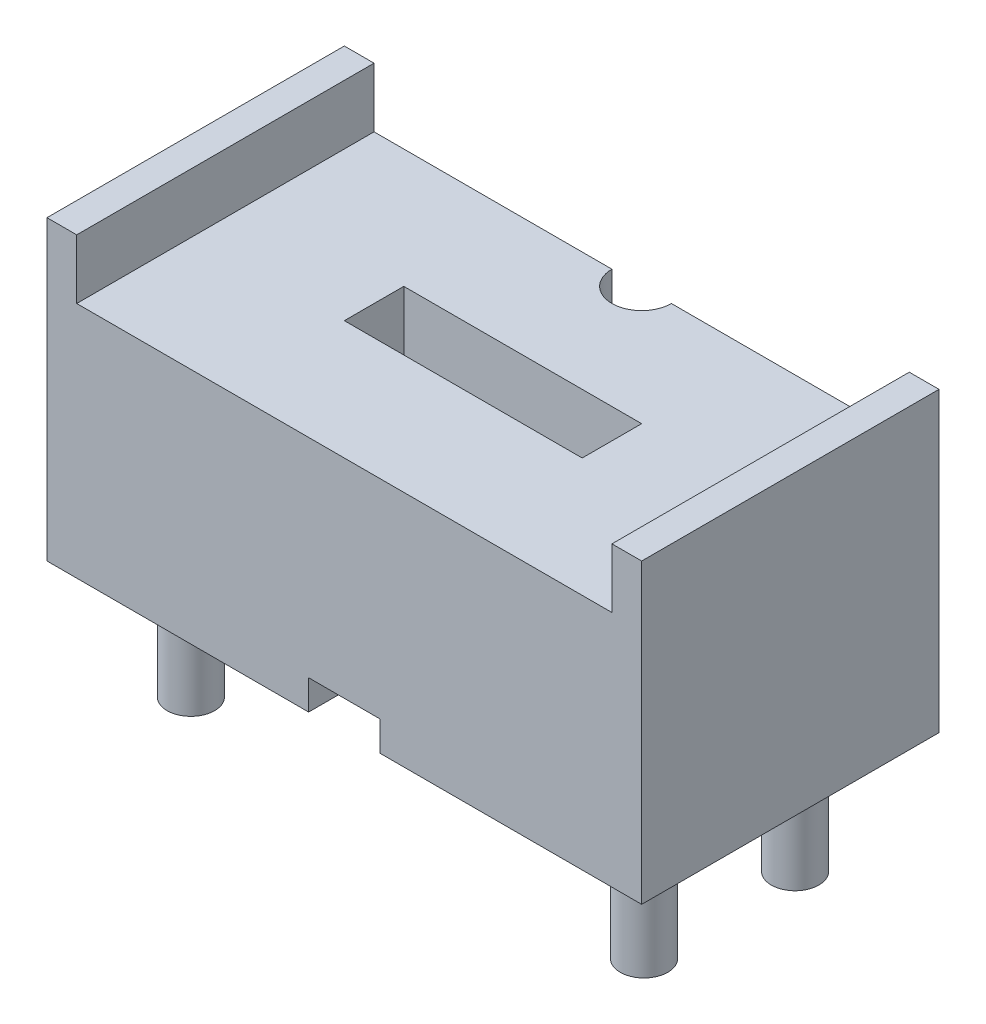
ISO-10303-21;
HEADER;
FILE_DESCRIPTION(('STEP AP214'),'2;1');
FILE_NAME('part.step','',(''),(''),'','','');
FILE_SCHEMA(('AUTOMOTIVE_DESIGN { 1 0 10303 214 1 1 1 1 }'));
ENDSEC;
DATA;
#1=APPLICATION_CONTEXT('core data for automotive mechanical design processes');
#2=APPLICATION_PROTOCOL_DEFINITION('international standard','automotive_design',2000,#1);
#3=PRODUCT_CONTEXT('',#1,'mechanical');
#4=PRODUCT('Part','Part','',(#3));
#5=PRODUCT_RELATED_PRODUCT_CATEGORY('part','',(#4));
#6=PRODUCT_DEFINITION_FORMATION('','',#4);
#7=PRODUCT_DEFINITION_CONTEXT('part definition',#1,'design');
#8=PRODUCT_DEFINITION('design','',#6,#7);
#9=PRODUCT_DEFINITION_SHAPE('','',#8);
#10=(LENGTH_UNIT() NAMED_UNIT(*) SI_UNIT(.MILLI.,.METRE.));
#11=(NAMED_UNIT(*) PLANE_ANGLE_UNIT() SI_UNIT($,.RADIAN.));
#12=(NAMED_UNIT(*) SI_UNIT($,.STERADIAN.) SOLID_ANGLE_UNIT());
#13=UNCERTAINTY_MEASURE_WITH_UNIT(LENGTH_MEASURE(1.E-05),#10,'distance_accuracy_value','');
#14=(GEOMETRIC_REPRESENTATION_CONTEXT(3) GLOBAL_UNCERTAINTY_ASSIGNED_CONTEXT((#13)) GLOBAL_UNIT_ASSIGNED_CONTEXT((#10,
#11,#12)) REPRESENTATION_CONTEXT('',''));
#15=CARTESIAN_POINT('',(0.,0.,0.));
#16=DIRECTION('',(0.,0.,1.));
#17=DIRECTION('',(1.,0.,0.));
#18=AXIS2_PLACEMENT_3D('',#15,#16,#17);
#19=CARTESIAN_POINT('',(0.,0.,0.));
#20=DIRECTION('',(0.,1.,0.));
#21=DIRECTION('',(0.,0.,1.));
#22=AXIS2_PLACEMENT_3D('',#19,#20,#21);
#23=PLANE('',#22);
#24=CARTESIAN_POINT('',(8.81,0.,-3.77));
#25=DIRECTION('',(0.,1.,0.));
#26=DIRECTION('',(0.,0.,1.));
#27=AXIS2_PLACEMENT_3D('',#24,#25,#26);
#28=CIRCLE('',#27,0.400000000000001);
#29=CARTESIAN_POINT('',(8.81,0.,-3.37));
#30=VERTEX_POINT('',#29);
#31=EDGE_CURVE('E43',#30,#30,#28,.F.);
#32=ORIENTED_EDGE('',*,*,#31,.F.);
#33=EDGE_LOOP('',(#32));
#34=FACE_BOUND('',#33,.T.);
#35=DIRECTION('',(0.,0.,1.));
#36=VECTOR('',#35,1.);
#37=CARTESIAN_POINT('',(5.6,0.,-5.001));
#38=LINE('',#37,#36);
#39=CARTESIAN_POINT('',(5.6,0.,-2.));
#40=VERTEX_POINT('',#39);
#41=CARTESIAN_POINT('',(5.6,0.,0.));
#42=VERTEX_POINT('',#41);
#43=EDGE_CURVE('E205',#40,#42,#38,.T.);
#44=ORIENTED_EDGE('',*,*,#43,.F.);
#45=DIRECTION('',(-1.,0.,0.));
#46=VECTOR('',#45,1.);
#47=CARTESIAN_POINT('',(3.,0.,-2.));
#48=LINE('',#47,#46);
#49=CARTESIAN_POINT('',(7.,0.,-2.));
#50=VERTEX_POINT('',#49);
#51=EDGE_CURVE('E185',#50,#40,#48,.T.);
#52=ORIENTED_EDGE('',*,*,#51,.F.);
#53=DIRECTION('',(0.,0.,1.));
#54=VECTOR('',#53,1.);
#55=CARTESIAN_POINT('',(7.,0.,-2.));
#56=LINE('',#55,#54);
#57=CARTESIAN_POINT('',(7.,0.,-3.));
#58=VERTEX_POINT('',#57);
#59=EDGE_CURVE('E194',#58,#50,#56,.T.);
#60=ORIENTED_EDGE('',*,*,#59,.F.);
#61=DIRECTION('',(1.,0.,0.));
#62=VECTOR('',#61,1.);
#63=CARTESIAN_POINT('',(7.,0.,-3.));
#64=LINE('',#63,#62);
#65=CARTESIAN_POINT('',(5.6,0.,-3.));
#66=VERTEX_POINT('',#65);
#67=EDGE_CURVE('E207',#66,#58,#64,.T.);
#68=ORIENTED_EDGE('',*,*,#67,.F.);
#69=CARTESIAN_POINT('',(5.6,0.,-5.));
#70=VERTEX_POINT('',#69);
#71=EDGE_CURVE('E270',#70,#66,#38,.T.);
#72=ORIENTED_EDGE('',*,*,#71,.F.);
#73=DIRECTION('',(-1.,0.,0.));
#74=VECTOR('',#73,1.);
#75=CARTESIAN_POINT('',(10.,0.,-5.));
#76=LINE('',#75,#74);
#77=CARTESIAN_POINT('',(10.,0.,-5.));
#78=VERTEX_POINT('',#77);
#79=EDGE_CURVE('E321',#78,#70,#76,.T.);
#80=ORIENTED_EDGE('',*,*,#79,.F.);
#81=DIRECTION('',(0.,0.,-1.));
#82=VECTOR('',#81,1.);
#83=CARTESIAN_POINT('',(10.,0.,0.));
#84=LINE('',#83,#82);
#85=CARTESIAN_POINT('',(10.,0.,0.));
#86=VERTEX_POINT('',#85);
#87=EDGE_CURVE('E338',#86,#78,#84,.T.);
#88=ORIENTED_EDGE('',*,*,#87,.F.);
#89=DIRECTION('',(1.,0.,0.));
#90=VECTOR('',#89,1.);
#91=CARTESIAN_POINT('',(0.,0.,0.));
#92=LINE('',#91,#90);
#93=EDGE_CURVE('E334',#42,#86,#92,.T.);
#94=ORIENTED_EDGE('',*,*,#93,.F.);
#95=EDGE_LOOP('',(#44,#52,#60,#68,#72,#80,#88,#94));
#96=FACE_BOUND('',#95,.T.);
#97=CARTESIAN_POINT('',(8.81,0.,-1.23));
#98=DIRECTION('',(0.,1.,0.));
#99=DIRECTION('',(0.,0.,1.));
#100=AXIS2_PLACEMENT_3D('',#97,#98,#99);
#101=CIRCLE('',#100,0.400000000000001);
#102=CARTESIAN_POINT('',(8.81,0.,-0.829999999999998));
#103=VERTEX_POINT('',#102);
#104=EDGE_CURVE('E11',#103,#103,#101,.F.);
#105=ORIENTED_EDGE('',*,*,#104,.F.);
#106=EDGE_LOOP('',(#105));
#107=FACE_BOUND('',#106,.T.);
#108=ADVANCED_FACE('F35',(#34,#96,#107),#23,.F.);
#109=CARTESIAN_POINT('',(1.19,0.,-1.23));
#110=DIRECTION('',(0.,1.,0.));
#111=DIRECTION('',(0.,0.,1.));
#112=AXIS2_PLACEMENT_3D('',#109,#110,#111);
#113=CIRCLE('',#112,0.4);
#114=CARTESIAN_POINT('',(1.19,0.,-0.83));
#115=VERTEX_POINT('',#114);
#116=EDGE_CURVE('E354',#115,#115,#113,.F.);
#117=ORIENTED_EDGE('',*,*,#116,.F.);
#118=EDGE_LOOP('',(#117));
#119=FACE_BOUND('',#118,.T.);
#120=DIRECTION('',(0.,0.,-1.));
#121=VECTOR('',#120,1.);
#122=CARTESIAN_POINT('',(3.,0.,-3.));
#123=LINE('',#122,#121);
#124=CARTESIAN_POINT('',(3.,0.,-2.));
#125=VERTEX_POINT('',#124);
#126=CARTESIAN_POINT('',(3.,0.,-3.));
#127=VERTEX_POINT('',#126);
#128=EDGE_CURVE('E219',#125,#127,#123,.T.);
#129=ORIENTED_EDGE('',*,*,#128,.F.);
#130=DIRECTION('',(-1.,0.,0.));
#131=VECTOR('',#130,1.);
#132=CARTESIAN_POINT('',(3.,0.,-2.));
#133=LINE('',#132,#131);
#134=CARTESIAN_POINT('',(4.4,0.,-2.));
#135=VERTEX_POINT('',#134);
#136=EDGE_CURVE('E222',#135,#125,#133,.T.);
#137=ORIENTED_EDGE('',*,*,#136,.F.);
#138=DIRECTION('',(0.,0.,1.));
#139=VECTOR('',#138,1.);
#140=CARTESIAN_POINT('',(4.4,0.,-5.001));
#141=LINE('',#140,#139);
#142=CARTESIAN_POINT('',(4.4,0.,0.));
#143=VERTEX_POINT('',#142);
#144=EDGE_CURVE('E261',#135,#143,#141,.T.);
#145=ORIENTED_EDGE('',*,*,#144,.T.);
#146=CARTESIAN_POINT('',(0.,0.,0.));
#147=VERTEX_POINT('',#146);
#148=EDGE_CURVE('E335',#147,#143,#92,.T.);
#149=ORIENTED_EDGE('',*,*,#148,.F.);
#150=DIRECTION('',(0.,0.,1.));
#151=VECTOR('',#150,1.);
#152=CARTESIAN_POINT('',(0.,0.,-5.));
#153=LINE('',#152,#151);
#154=CARTESIAN_POINT('',(0.,0.,-5.));
#155=VERTEX_POINT('',#154);
#156=EDGE_CURVE('E316',#155,#147,#153,.T.);
#157=ORIENTED_EDGE('',*,*,#156,.F.);
#158=CARTESIAN_POINT('',(4.4,0.,-5.));
#159=VERTEX_POINT('',#158);
#160=EDGE_CURVE('E340',#159,#155,#76,.T.);
#161=ORIENTED_EDGE('',*,*,#160,.F.);
#162=CARTESIAN_POINT('',(4.4,0.,-3.));
#163=VERTEX_POINT('',#162);
#164=EDGE_CURVE('E257',#159,#163,#141,.T.);
#165=ORIENTED_EDGE('',*,*,#164,.T.);
#166=DIRECTION('',(1.,0.,0.));
#167=VECTOR('',#166,1.);
#168=CARTESIAN_POINT('',(7.,0.,-3.));
#169=LINE('',#168,#167);
#170=EDGE_CURVE('E241',#127,#163,#169,.T.);
#171=ORIENTED_EDGE('',*,*,#170,.F.);
#172=EDGE_LOOP('',(#129,#137,#145,#149,#157,#161,#165,#171));
#173=FACE_BOUND('',#172,.T.);
#174=CARTESIAN_POINT('',(1.19,0.,-3.77));
#175=DIRECTION('',(0.,1.,0.));
#176=DIRECTION('',(0.,0.,1.));
#177=AXIS2_PLACEMENT_3D('',#174,#175,#176);
#178=CIRCLE('',#177,0.4);
#179=CARTESIAN_POINT('',(1.19,0.,-3.37));
#180=VERTEX_POINT('',#179);
#181=EDGE_CURVE('E357',#180,#180,#178,.F.);
#182=ORIENTED_EDGE('',*,*,#181,.F.);
#183=EDGE_LOOP('',(#182));
#184=FACE_BOUND('',#183,.T.);
#185=ADVANCED_FACE('F365',(#119,#173,#184),#23,.F.);
#186=CARTESIAN_POINT('',(4.4,-6.33768492170035,-5.001));
#187=DIRECTION('',(-1.,0.,0.));
#188=DIRECTION('',(0.,0.,1.));
#189=AXIS2_PLACEMENT_3D('',#186,#187,#188);
#190=PLANE('',#189);
#191=ORIENTED_EDGE('',*,*,#144,.F.);
#192=DIRECTION('',(0.,-1.,0.));
#193=VECTOR('',#192,1.);
#194=CARTESIAN_POINT('',(4.4,-0.00100000000000013,-2.));
#195=LINE('',#194,#193);
#196=CARTESIAN_POINT('',(4.4,0.5,-2.));
#197=VERTEX_POINT('',#196);
#198=EDGE_CURVE('E217',#197,#135,#195,.T.);
#199=ORIENTED_EDGE('',*,*,#198,.F.);
#200=DIRECTION('',(0.,0.,1.));
#201=VECTOR('',#200,1.);
#202=CARTESIAN_POINT('',(4.4,0.5,-5.001));
#203=LINE('',#202,#201);
#204=CARTESIAN_POINT('',(4.4,0.5,0.));
#205=VERTEX_POINT('',#204);
#206=EDGE_CURVE('E265',#197,#205,#203,.T.);
#207=ORIENTED_EDGE('',*,*,#206,.T.);
#208=DIRECTION('',(0.,-1.,0.));
#209=VECTOR('',#208,1.);
#210=CARTESIAN_POINT('',(4.4,-6.33768492170035,0.));
#211=LINE('',#210,#209);
#212=EDGE_CURVE('E254',#205,#143,#211,.T.);
#213=ORIENTED_EDGE('',*,*,#212,.T.);
#214=EDGE_LOOP('',(#191,#199,#207,#213));
#215=FACE_BOUND('',#214,.T.);
#216=ADVANCED_FACE('F370',(#215),#190,.F.);
#217=CARTESIAN_POINT('',(5.,0.5,-5.001));
#218=DIRECTION('',(0.,-1.,0.));
#219=DIRECTION('',(1.,0.,0.));
#220=AXIS2_PLACEMENT_3D('',#217,#218,#219);
#221=PLANE('',#220);
#222=DIRECTION('',(1.,0.,0.));
#223=VECTOR('',#222,1.);
#224=CARTESIAN_POINT('',(3.,0.5,-2.));
#225=LINE('',#224,#223);
#226=CARTESIAN_POINT('',(5.6,0.5,-2.));
#227=VERTEX_POINT('',#226);
#228=EDGE_CURVE('E209',#197,#227,#225,.T.);
#229=ORIENTED_EDGE('',*,*,#228,.T.);
#230=DIRECTION('',(0.,0.,1.));
#231=VECTOR('',#230,1.);
#232=CARTESIAN_POINT('',(5.6,0.5,-5.001));
#233=LINE('',#232,#231);
#234=CARTESIAN_POINT('',(5.6,0.5,0.));
#235=VERTEX_POINT('',#234);
#236=EDGE_CURVE('E269',#227,#235,#233,.T.);
#237=ORIENTED_EDGE('',*,*,#236,.T.);
#238=DIRECTION('',(1.,0.,0.));
#239=VECTOR('',#238,1.);
#240=CARTESIAN_POINT('',(5.,0.5,0.));
#241=LINE('',#240,#239);
#242=EDGE_CURVE('E251',#205,#235,#241,.T.);
#243=ORIENTED_EDGE('',*,*,#242,.F.);
#244=ORIENTED_EDGE('',*,*,#206,.F.);
#245=EDGE_LOOP('',(#229,#237,#243,#244));
#246=FACE_BOUND('',#245,.T.);
#247=ADVANCED_FACE('F406',(#246),#221,.T.);
#248=CARTESIAN_POINT('',(5.59999999999999,-6.33768492170036,-5.001));
#249=DIRECTION('',(-1.,0.,0.));
#250=DIRECTION('',(0.,-1.,0.));
#251=AXIS2_PLACEMENT_3D('',#248,#249,#250);
#252=PLANE('',#251);
#253=DIRECTION('',(0.,-1.,0.));
#254=VECTOR('',#253,1.);
#255=CARTESIAN_POINT('',(5.6,-0.00100000000000464,-2.));
#256=LINE('',#255,#254);
#257=EDGE_CURVE('E206',#227,#40,#256,.T.);
#258=ORIENTED_EDGE('',*,*,#257,.T.);
#259=ORIENTED_EDGE('',*,*,#43,.T.);
#260=DIRECTION('',(0.,-1.,0.));
#261=VECTOR('',#260,1.);
#262=CARTESIAN_POINT('',(5.59999999999999,-6.33768492170036,0.));
#263=LINE('',#262,#261);
#264=EDGE_CURVE('E248',#235,#42,#263,.T.);
#265=ORIENTED_EDGE('',*,*,#264,.F.);
#266=ORIENTED_EDGE('',*,*,#236,.F.);
#267=EDGE_LOOP('',(#258,#259,#265,#266));
#268=FACE_BOUND('',#267,.T.);
#269=ADVANCED_FACE('F460',(#268),#252,.T.);
#270=CARTESIAN_POINT('',(10.,5.,-5.));
#271=DIRECTION('',(0.,0.,1.));
#272=DIRECTION('',(1.,0.,0.));
#273=AXIS2_PLACEMENT_3D('',#270,#271,#272);
#274=PLANE('',#273);
#275=DIRECTION('',(-1.,0.,0.));
#276=VECTOR('',#275,1.);
#277=CARTESIAN_POINT('',(5.,0.5,-5.));
#278=LINE('',#277,#276);
#279=CARTESIAN_POINT('',(5.6,0.5,-5.));
#280=VERTEX_POINT('',#279);
#281=CARTESIAN_POINT('',(5.5,0.5,-5.));
#282=VERTEX_POINT('',#281);
#283=EDGE_CURVE('E243',#280,#282,#278,.T.);
#284=ORIENTED_EDGE('',*,*,#283,.T.);
#285=DIRECTION('',(0.,1.,0.));
#286=VECTOR('',#285,1.);
#287=CARTESIAN_POINT('',(5.5,-0.00100000000000013,-5.));
#288=LINE('',#287,#286);
#289=CARTESIAN_POINT('',(5.5,4.,-5.));
#290=VERTEX_POINT('',#289);
#291=EDGE_CURVE('E313',#290,#282,#288,.F.);
#292=ORIENTED_EDGE('',*,*,#291,.F.);
#293=DIRECTION('',(-1.,0.,0.));
#294=VECTOR('',#293,1.);
#295=CARTESIAN_POINT('',(5.,4.,-5.));
#296=LINE('',#295,#294);
#297=CARTESIAN_POINT('',(9.5,4.,-5.));
#298=VERTEX_POINT('',#297);
#299=EDGE_CURVE('E281',#298,#290,#296,.T.);
#300=ORIENTED_EDGE('',*,*,#299,.F.);
#301=DIRECTION('',(0.,-1.,0.));
#302=VECTOR('',#301,1.);
#303=CARTESIAN_POINT('',(9.5,-6.33768492170035,-5.));
#304=LINE('',#303,#302);
#305=CARTESIAN_POINT('',(9.5,5.,-5.));
#306=VERTEX_POINT('',#305);
#307=EDGE_CURVE('E302',#306,#298,#304,.T.);
#308=ORIENTED_EDGE('',*,*,#307,.F.);
#309=DIRECTION('',(-1.,0.,0.));
#310=VECTOR('',#309,1.);
#311=CARTESIAN_POINT('',(10.,5.,-5.));
#312=LINE('',#311,#310);
#313=CARTESIAN_POINT('',(10.,5.,-5.));
#314=VERTEX_POINT('',#313);
#315=EDGE_CURVE('E328',#314,#306,#312,.T.);
#316=ORIENTED_EDGE('',*,*,#315,.F.);
#317=DIRECTION('',(0.,-1.,0.));
#318=VECTOR('',#317,1.);
#319=CARTESIAN_POINT('',(10.,5.,-5.));
#320=LINE('',#319,#318);
#321=EDGE_CURVE('E345',#314,#78,#320,.T.);
#322=ORIENTED_EDGE('',*,*,#321,.T.);
#323=ORIENTED_EDGE('',*,*,#79,.T.);
#324=DIRECTION('',(0.,1.,0.));
#325=VECTOR('',#324,1.);
#326=CARTESIAN_POINT('',(5.59999999999999,-6.33768492170036,-5.));
#327=LINE('',#326,#325);
#328=EDGE_CURVE('E260',#70,#280,#327,.T.);
#329=ORIENTED_EDGE('',*,*,#328,.T.);
#330=EDGE_LOOP('',(#284,#292,#300,#308,#316,#322,#323,#329));
#331=FACE_BOUND('',#330,.T.);
#332=ADVANCED_FACE('F381',(#331),#274,.F.);
#333=CARTESIAN_POINT('',(5.,-0.00100000000000013,-5.));
#334=DIRECTION('',(0.,1.,0.));
#335=DIRECTION('',(0.,0.,1.));
#336=AXIS2_PLACEMENT_3D('',#333,#334,#335);
#337=CYLINDRICAL_SURFACE('',#336,0.5);
#338=CARTESIAN_POINT('',(5.,0.5,-5.));
#339=DIRECTION('',(0.,-1.,0.));
#340=DIRECTION('',(1.,0.,0.));
#341=AXIS2_PLACEMENT_3D('',#338,#339,#340);
#342=CIRCLE('',#341,0.5);
#343=CARTESIAN_POINT('',(4.5,0.5,-5.));
#344=VERTEX_POINT('',#343);
#345=EDGE_CURVE('E275',#282,#344,#342,.T.);
#346=ORIENTED_EDGE('',*,*,#345,.T.);
#347=DIRECTION('',(0.,1.,0.));
#348=VECTOR('',#347,1.);
#349=CARTESIAN_POINT('',(4.5,-0.00100000000000013,-5.));
#350=LINE('',#349,#348);
#351=CARTESIAN_POINT('',(4.5,4.,-5.));
#352=VERTEX_POINT('',#351);
#353=EDGE_CURVE('E311',#344,#352,#350,.T.);
#354=ORIENTED_EDGE('',*,*,#353,.T.);
#355=CARTESIAN_POINT('',(5.,4.,-5.));
#356=DIRECTION('',(0.,-1.,0.));
#357=DIRECTION('',(0.,0.,-1.));
#358=AXIS2_PLACEMENT_3D('',#355,#356,#357);
#359=CIRCLE('',#358,0.5);
#360=EDGE_CURVE('E283',#290,#352,#359,.T.);
#361=ORIENTED_EDGE('',*,*,#360,.F.);
#362=ORIENTED_EDGE('',*,*,#291,.T.);
#363=EDGE_LOOP('',(#346,#354,#361,#362));
#364=FACE_BOUND('',#363,.T.);
#365=ADVANCED_FACE('F453',(#364),#337,.F.);
#366=CARTESIAN_POINT('',(0.,5.,0.));
#367=DIRECTION('',(0.,1.,0.));
#368=DIRECTION('',(0.,0.,1.));
#369=AXIS2_PLACEMENT_3D('',#366,#367,#368);
#370=PLANE('',#369);
#371=DIRECTION('',(0.,0.,1.));
#372=VECTOR('',#371,1.);
#373=CARTESIAN_POINT('',(0.5,5.,-5.001));
#374=LINE('',#373,#372);
#375=CARTESIAN_POINT('',(0.5,5.,-5.));
#376=VERTEX_POINT('',#375);
#377=CARTESIAN_POINT('',(0.5,5.,0.));
#378=VERTEX_POINT('',#377);
#379=EDGE_CURVE('E303',#376,#378,#374,.T.);
#380=ORIENTED_EDGE('',*,*,#379,.F.);
#381=CARTESIAN_POINT('',(0.,5.,-5.));
#382=VERTEX_POINT('',#381);
#383=EDGE_CURVE('E327',#376,#382,#312,.T.);
#384=ORIENTED_EDGE('',*,*,#383,.T.);
#385=DIRECTION('',(0.,0.,1.));
#386=VECTOR('',#385,1.);
#387=CARTESIAN_POINT('',(0.,5.,-5.));
#388=LINE('',#387,#386);
#389=CARTESIAN_POINT('',(0.,5.,0.));
#390=VERTEX_POINT('',#389);
#391=EDGE_CURVE('E317',#382,#390,#388,.T.);
#392=ORIENTED_EDGE('',*,*,#391,.T.);
#393=DIRECTION('',(1.,0.,0.));
#394=VECTOR('',#393,1.);
#395=CARTESIAN_POINT('',(0.,5.,0.));
#396=LINE('',#395,#394);
#397=EDGE_CURVE('E322',#390,#378,#396,.T.);
#398=ORIENTED_EDGE('',*,*,#397,.T.);
#399=EDGE_LOOP('',(#380,#384,#392,#398));
#400=FACE_BOUND('',#399,.T.);
#401=ADVANCED_FACE('F390',(#400),#370,.T.);
#402=CARTESIAN_POINT('',(0.,5.,-5.));
#403=DIRECTION('',(1.,0.,0.));
#404=DIRECTION('',(0.,0.,-1.));
#405=AXIS2_PLACEMENT_3D('',#402,#403,#404);
#406=PLANE('',#405);
#407=ORIENTED_EDGE('',*,*,#156,.T.);
#408=DIRECTION('',(0.,-1.,0.));
#409=VECTOR('',#408,1.);
#410=CARTESIAN_POINT('',(0.,5.,0.));
#411=LINE('',#410,#409);
#412=EDGE_CURVE('E351',#390,#147,#411,.T.);
#413=ORIENTED_EDGE('',*,*,#412,.F.);
#414=ORIENTED_EDGE('',*,*,#391,.F.);
#415=DIRECTION('',(0.,-1.,0.));
#416=VECTOR('',#415,1.);
#417=CARTESIAN_POINT('',(0.,5.,-5.));
#418=LINE('',#417,#416);
#419=EDGE_CURVE('E331',#382,#155,#418,.T.);
#420=ORIENTED_EDGE('',*,*,#419,.T.);
#421=EDGE_LOOP('',(#407,#413,#414,#420));
#422=FACE_BOUND('',#421,.T.);
#423=ADVANCED_FACE('F37',(#422),#406,.F.);
#424=CARTESIAN_POINT('',(0.,5.,0.));
#425=DIRECTION('',(0.,0.,-1.));
#426=DIRECTION('',(-1.,0.,0.));
#427=AXIS2_PLACEMENT_3D('',#424,#425,#426);
#428=PLANE('',#427);
#429=ORIENTED_EDGE('',*,*,#148,.T.);
#430=ORIENTED_EDGE('',*,*,#212,.F.);
#431=ORIENTED_EDGE('',*,*,#242,.T.);
#432=ORIENTED_EDGE('',*,*,#264,.T.);
#433=ORIENTED_EDGE('',*,*,#93,.T.);
#434=DIRECTION('',(0.,-1.,0.));
#435=VECTOR('',#434,1.);
#436=CARTESIAN_POINT('',(10.,5.,0.));
#437=LINE('',#436,#435);
#438=CARTESIAN_POINT('',(10.,5.,0.));
#439=VERTEX_POINT('',#438);
#440=EDGE_CURVE('E348',#439,#86,#437,.T.);
#441=ORIENTED_EDGE('',*,*,#440,.F.);
#442=CARTESIAN_POINT('',(9.5,5.,0.));
#443=VERTEX_POINT('',#442);
#444=EDGE_CURVE('E320',#443,#439,#396,.T.);
#445=ORIENTED_EDGE('',*,*,#444,.F.);
#446=DIRECTION('',(0.,1.,0.));
#447=VECTOR('',#446,1.);
#448=CARTESIAN_POINT('',(9.5,-6.33768492170035,0.));
#449=LINE('',#448,#447);
#450=CARTESIAN_POINT('',(9.5,4.,0.));
#451=VERTEX_POINT('',#450);
#452=EDGE_CURVE('E294',#451,#443,#449,.T.);
#453=ORIENTED_EDGE('',*,*,#452,.F.);
#454=DIRECTION('',(1.,0.,0.));
#455=VECTOR('',#454,1.);
#456=CARTESIAN_POINT('',(5.,4.,0.));
#457=LINE('',#456,#455);
#458=CARTESIAN_POINT('',(0.499999999999999,4.,0.));
#459=VERTEX_POINT('',#458);
#460=EDGE_CURVE('E291',#459,#451,#457,.T.);
#461=ORIENTED_EDGE('',*,*,#460,.F.);
#462=DIRECTION('',(0.,-1.,0.));
#463=VECTOR('',#462,1.);
#464=CARTESIAN_POINT('',(0.5,-6.33768492170036,0.));
#465=LINE('',#464,#463);
#466=EDGE_CURVE('E296',#378,#459,#465,.T.);
#467=ORIENTED_EDGE('',*,*,#466,.F.);
#468=ORIENTED_EDGE('',*,*,#397,.F.);
#469=ORIENTED_EDGE('',*,*,#412,.T.);
#470=EDGE_LOOP('',(#429,#430,#431,#432,#433,#441,#445,#453,#461,#467,#468,#469));
#471=FACE_BOUND('',#470,.T.);
#472=ADVANCED_FACE('F383',(#471),#428,.F.);
#473=CARTESIAN_POINT('',(10.,5.,0.));
#474=DIRECTION('',(-1.,0.,0.));
#475=DIRECTION('',(0.,0.,1.));
#476=AXIS2_PLACEMENT_3D('',#473,#474,#475);
#477=PLANE('',#476);
#478=ORIENTED_EDGE('',*,*,#87,.T.);
#479=ORIENTED_EDGE('',*,*,#321,.F.);
#480=DIRECTION('',(0.,0.,-1.));
#481=VECTOR('',#480,1.);
#482=CARTESIAN_POINT('',(10.,5.,0.));
#483=LINE('',#482,#481);
#484=EDGE_CURVE('E325',#439,#314,#483,.T.);
#485=ORIENTED_EDGE('',*,*,#484,.F.);
#486=ORIENTED_EDGE('',*,*,#440,.T.);
#487=EDGE_LOOP('',(#478,#479,#485,#486));
#488=FACE_BOUND('',#487,.T.);
#489=ADVANCED_FACE('F379',(#488),#477,.F.);
#490=DIRECTION('',(-1.,0.,0.));
#491=VECTOR('',#490,1.);
#492=CARTESIAN_POINT('',(5.,0.5,-5.));
#493=LINE('',#492,#491);
#494=CARTESIAN_POINT('',(4.4,0.5,-5.));
#495=VERTEX_POINT('',#494);
#496=EDGE_CURVE('E278',#344,#495,#493,.T.);
#497=ORIENTED_EDGE('',*,*,#496,.T.);
#498=DIRECTION('',(0.,1.,0.));
#499=VECTOR('',#498,1.);
#500=CARTESIAN_POINT('',(4.4,-6.33768492170035,-5.));
#501=LINE('',#500,#499);
#502=EDGE_CURVE('E246',#159,#495,#501,.T.);
#503=ORIENTED_EDGE('',*,*,#502,.F.);
#504=ORIENTED_EDGE('',*,*,#160,.T.);
#505=ORIENTED_EDGE('',*,*,#419,.F.);
#506=ORIENTED_EDGE('',*,*,#383,.F.);
#507=DIRECTION('',(0.,1.,0.));
#508=VECTOR('',#507,1.);
#509=CARTESIAN_POINT('',(0.5,-6.33768492170036,-5.));
#510=LINE('',#509,#508);
#511=CARTESIAN_POINT('',(0.499999999999999,4.,-5.));
#512=VERTEX_POINT('',#511);
#513=EDGE_CURVE('E286',#512,#376,#510,.T.);
#514=ORIENTED_EDGE('',*,*,#513,.F.);
#515=DIRECTION('',(-1.,0.,0.));
#516=VECTOR('',#515,1.);
#517=CARTESIAN_POINT('',(5.,4.,-5.));
#518=LINE('',#517,#516);
#519=EDGE_CURVE('E288',#352,#512,#518,.T.);
#520=ORIENTED_EDGE('',*,*,#519,.F.);
#521=ORIENTED_EDGE('',*,*,#353,.F.);
#522=EDGE_LOOP('',(#497,#503,#504,#505,#506,#514,#520,#521));
#523=FACE_BOUND('',#522,.T.);
#524=ADVANCED_FACE('F376',(#523),#274,.F.);
#525=DIRECTION('',(0.,0.,1.));
#526=VECTOR('',#525,1.);
#527=CARTESIAN_POINT('',(9.5,5.,-5.001));
#528=LINE('',#527,#526);
#529=EDGE_CURVE('E305',#306,#443,#528,.T.);
#530=ORIENTED_EDGE('',*,*,#529,.T.);
#531=ORIENTED_EDGE('',*,*,#444,.T.);
#532=ORIENTED_EDGE('',*,*,#484,.T.);
#533=ORIENTED_EDGE('',*,*,#315,.T.);
#534=EDGE_LOOP('',(#530,#531,#532,#533));
#535=FACE_BOUND('',#534,.T.);
#536=ADVANCED_FACE('F374',(#535),#370,.T.);
#537=CARTESIAN_POINT('',(5.,4.,-5.001));
#538=DIRECTION('',(0.,-1.,0.));
#539=DIRECTION('',(0.,0.,-1.));
#540=AXIS2_PLACEMENT_3D('',#537,#538,#539);
#541=PLANE('',#540);
#542=DIRECTION('',(0.,0.,-1.));
#543=VECTOR('',#542,1.);
#544=CARTESIAN_POINT('',(7.,4.,-2.));
#545=LINE('',#544,#543);
#546=CARTESIAN_POINT('',(7.,4.,-2.));
#547=VERTEX_POINT('',#546);
#548=CARTESIAN_POINT('',(7.,4.,-3.));
#549=VERTEX_POINT('',#548);
#550=EDGE_CURVE('E226',#547,#549,#545,.T.);
#551=ORIENTED_EDGE('',*,*,#550,.F.);
#552=DIRECTION('',(1.,0.,0.));
#553=VECTOR('',#552,1.);
#554=CARTESIAN_POINT('',(3.,4.,-2.));
#555=LINE('',#554,#553);
#556=CARTESIAN_POINT('',(3.,4.,-2.));
#557=VERTEX_POINT('',#556);
#558=EDGE_CURVE('E50',#557,#547,#555,.T.);
#559=ORIENTED_EDGE('',*,*,#558,.F.);
#560=DIRECTION('',(0.,0.,1.));
#561=VECTOR('',#560,1.);
#562=CARTESIAN_POINT('',(3.,4.,-3.));
#563=LINE('',#562,#561);
#564=CARTESIAN_POINT('',(3.,4.,-3.));
#565=VERTEX_POINT('',#564);
#566=EDGE_CURVE('E191',#565,#557,#563,.T.);
#567=ORIENTED_EDGE('',*,*,#566,.F.);
#568=DIRECTION('',(-1.,0.,0.));
#569=VECTOR('',#568,1.);
#570=CARTESIAN_POINT('',(7.,4.,-3.));
#571=LINE('',#570,#569);
#572=EDGE_CURVE('E228',#549,#565,#571,.T.);
#573=ORIENTED_EDGE('',*,*,#572,.F.);
#574=EDGE_LOOP('',(#551,#559,#567,#573));
#575=FACE_BOUND('',#574,.T.);
#576=ORIENTED_EDGE('',*,*,#299,.T.);
#577=ORIENTED_EDGE('',*,*,#360,.T.);
#578=ORIENTED_EDGE('',*,*,#519,.T.);
#579=DIRECTION('',(0.,0.,1.));
#580=VECTOR('',#579,1.);
#581=CARTESIAN_POINT('',(0.499999999999999,4.,-5.001));
#582=LINE('',#581,#580);
#583=EDGE_CURVE('E300',#512,#459,#582,.T.);
#584=ORIENTED_EDGE('',*,*,#583,.T.);
#585=ORIENTED_EDGE('',*,*,#460,.T.);
#586=DIRECTION('',(0.,0.,1.));
#587=VECTOR('',#586,1.);
#588=CARTESIAN_POINT('',(9.5,4.,-5.001));
#589=LINE('',#588,#587);
#590=EDGE_CURVE('E299',#298,#451,#589,.T.);
#591=ORIENTED_EDGE('',*,*,#590,.F.);
#592=EDGE_LOOP('',(#576,#577,#578,#584,#585,#591));
#593=FACE_BOUND('',#592,.T.);
#594=ADVANCED_FACE('F428',(#575,#593),#541,.F.);
#595=CARTESIAN_POINT('',(0.5,-6.33768492170036,-5.001));
#596=DIRECTION('',(-1.,0.,0.));
#597=DIRECTION('',(0.,-1.,0.));
#598=AXIS2_PLACEMENT_3D('',#595,#596,#597);
#599=PLANE('',#598);
#600=ORIENTED_EDGE('',*,*,#513,.T.);
#601=ORIENTED_EDGE('',*,*,#379,.T.);
#602=ORIENTED_EDGE('',*,*,#466,.T.);
#603=ORIENTED_EDGE('',*,*,#583,.F.);
#604=EDGE_LOOP('',(#600,#601,#602,#603));
#605=FACE_BOUND('',#604,.T.);
#606=ADVANCED_FACE('F432',(#605),#599,.F.);
#607=CARTESIAN_POINT('',(9.5,-6.33768492170035,-5.001));
#608=DIRECTION('',(1.,0.,0.));
#609=DIRECTION('',(0.,0.,-1.));
#610=AXIS2_PLACEMENT_3D('',#607,#608,#609);
#611=PLANE('',#610);
#612=ORIENTED_EDGE('',*,*,#307,.T.);
#613=ORIENTED_EDGE('',*,*,#590,.T.);
#614=ORIENTED_EDGE('',*,*,#452,.T.);
#615=ORIENTED_EDGE('',*,*,#529,.F.);
#616=EDGE_LOOP('',(#612,#613,#614,#615));
#617=FACE_BOUND('',#616,.T.);
#618=ADVANCED_FACE('F426',(#617),#611,.F.);
#619=CARTESIAN_POINT('',(4.4,0.5,-3.));
#620=VERTEX_POINT('',#619);
#621=EDGE_CURVE('E262',#495,#620,#203,.T.);
#622=ORIENTED_EDGE('',*,*,#621,.T.);
#623=DIRECTION('',(0.,1.,0.));
#624=VECTOR('',#623,1.);
#625=CARTESIAN_POINT('',(4.4,-0.00100000000000013,-3.));
#626=LINE('',#625,#624);
#627=EDGE_CURVE('E239',#163,#620,#626,.T.);
#628=ORIENTED_EDGE('',*,*,#627,.F.);
#629=ORIENTED_EDGE('',*,*,#164,.F.);
#630=ORIENTED_EDGE('',*,*,#502,.T.);
#631=EDGE_LOOP('',(#622,#628,#629,#630));
#632=FACE_BOUND('',#631,.T.);
#633=ADVANCED_FACE('F442',(#632),#190,.F.);
#634=DIRECTION('',(-1.,0.,0.));
#635=VECTOR('',#634,1.);
#636=CARTESIAN_POINT('',(7.,0.500000000000001,-3.));
#637=LINE('',#636,#635);
#638=CARTESIAN_POINT('',(5.6,0.5,-3.));
#639=VERTEX_POINT('',#638);
#640=EDGE_CURVE('E58',#639,#620,#637,.T.);
#641=ORIENTED_EDGE('',*,*,#640,.T.);
#642=ORIENTED_EDGE('',*,*,#621,.F.);
#643=ORIENTED_EDGE('',*,*,#496,.F.);
#644=ORIENTED_EDGE('',*,*,#345,.F.);
#645=ORIENTED_EDGE('',*,*,#283,.F.);
#646=EDGE_CURVE('E266',#280,#639,#233,.T.);
#647=ORIENTED_EDGE('',*,*,#646,.T.);
#648=EDGE_LOOP('',(#641,#642,#643,#644,#645,#647));
#649=FACE_BOUND('',#648,.T.);
#650=ADVANCED_FACE('F446',(#649),#221,.T.);
#651=DIRECTION('',(0.,1.,0.));
#652=VECTOR('',#651,1.);
#653=CARTESIAN_POINT('',(5.6,-0.000999999999997704,-3.));
#654=LINE('',#653,#652);
#655=EDGE_CURVE('E199',#66,#639,#654,.T.);
#656=ORIENTED_EDGE('',*,*,#655,.T.);
#657=ORIENTED_EDGE('',*,*,#646,.F.);
#658=ORIENTED_EDGE('',*,*,#328,.F.);
#659=ORIENTED_EDGE('',*,*,#71,.T.);
#660=EDGE_LOOP('',(#656,#657,#658,#659));
#661=FACE_BOUND('',#660,.T.);
#662=ADVANCED_FACE('F449',(#661),#252,.T.);
#663=CARTESIAN_POINT('',(3.,-0.00100000000000013,-2.));
#664=DIRECTION('',(0.,0.,1.));
#665=DIRECTION('',(1.,0.,0.));
#666=AXIS2_PLACEMENT_3D('',#663,#664,#665);
#667=PLANE('',#666);
#668=ORIENTED_EDGE('',*,*,#51,.T.);
#669=ORIENTED_EDGE('',*,*,#257,.F.);
#670=ORIENTED_EDGE('',*,*,#228,.F.);
#671=ORIENTED_EDGE('',*,*,#198,.T.);
#672=ORIENTED_EDGE('',*,*,#136,.T.);
#673=DIRECTION('',(0.,1.,0.));
#674=VECTOR('',#673,1.);
#675=CARTESIAN_POINT('',(3.,-0.00100000000000013,-2.));
#676=LINE('',#675,#674);
#677=EDGE_CURVE('E200',#125,#557,#676,.T.);
#678=ORIENTED_EDGE('',*,*,#677,.T.);
#679=ORIENTED_EDGE('',*,*,#558,.T.);
#680=DIRECTION('',(0.,1.,0.));
#681=VECTOR('',#680,1.);
#682=CARTESIAN_POINT('',(7.,-0.00100000000000013,-2.));
#683=LINE('',#682,#681);
#684=EDGE_CURVE('E181',#50,#547,#683,.T.);
#685=ORIENTED_EDGE('',*,*,#684,.F.);
#686=EDGE_LOOP('',(#668,#669,#670,#671,#672,#678,#679,#685));
#687=FACE_BOUND('',#686,.T.);
#688=ADVANCED_FACE('F183',(#687),#667,.F.);
#689=CARTESIAN_POINT('',(3.,-0.00100000000000013,-3.));
#690=DIRECTION('',(-1.,0.,0.));
#691=DIRECTION('',(0.,0.,1.));
#692=AXIS2_PLACEMENT_3D('',#689,#690,#691);
#693=PLANE('',#692);
#694=ORIENTED_EDGE('',*,*,#128,.T.);
#695=DIRECTION('',(0.,1.,0.));
#696=VECTOR('',#695,1.);
#697=CARTESIAN_POINT('',(3.,-0.00100000000000013,-3.));
#698=LINE('',#697,#696);
#699=EDGE_CURVE('E234',#127,#565,#698,.T.);
#700=ORIENTED_EDGE('',*,*,#699,.T.);
#701=ORIENTED_EDGE('',*,*,#566,.T.);
#702=ORIENTED_EDGE('',*,*,#677,.F.);
#703=EDGE_LOOP('',(#694,#700,#701,#702));
#704=FACE_BOUND('',#703,.T.);
#705=ADVANCED_FACE('F477',(#704),#693,.F.);
#706=CARTESIAN_POINT('',(7.,-0.00100000000000013,-3.));
#707=DIRECTION('',(0.,0.,-1.));
#708=DIRECTION('',(-1.,0.,0.));
#709=AXIS2_PLACEMENT_3D('',#706,#707,#708);
#710=PLANE('',#709);
#711=ORIENTED_EDGE('',*,*,#67,.T.);
#712=DIRECTION('',(0.,1.,0.));
#713=VECTOR('',#712,1.);
#714=CARTESIAN_POINT('',(7.,-0.00100000000000013,-3.));
#715=LINE('',#714,#713);
#716=EDGE_CURVE('E190',#58,#549,#715,.T.);
#717=ORIENTED_EDGE('',*,*,#716,.T.);
#718=ORIENTED_EDGE('',*,*,#572,.T.);
#719=ORIENTED_EDGE('',*,*,#699,.F.);
#720=ORIENTED_EDGE('',*,*,#170,.T.);
#721=ORIENTED_EDGE('',*,*,#627,.T.);
#722=ORIENTED_EDGE('',*,*,#640,.F.);
#723=ORIENTED_EDGE('',*,*,#655,.F.);
#724=EDGE_LOOP('',(#711,#717,#718,#719,#720,#721,#722,#723));
#725=FACE_BOUND('',#724,.T.);
#726=ADVANCED_FACE('F444',(#725),#710,.F.);
#727=CARTESIAN_POINT('',(7.,-0.00100000000000013,-2.));
#728=DIRECTION('',(1.,0.,0.));
#729=DIRECTION('',(0.,0.,-1.));
#730=AXIS2_PLACEMENT_3D('',#727,#728,#729);
#731=PLANE('',#730);
#732=ORIENTED_EDGE('',*,*,#59,.T.);
#733=ORIENTED_EDGE('',*,*,#684,.T.);
#734=ORIENTED_EDGE('',*,*,#550,.T.);
#735=ORIENTED_EDGE('',*,*,#716,.F.);
#736=EDGE_LOOP('',(#732,#733,#734,#735));
#737=FACE_BOUND('',#736,.T.);
#738=ADVANCED_FACE('F195',(#737),#731,.F.);
#739=CARTESIAN_POINT('',(1.19,-2.,-1.23));
#740=DIRECTION('',(0.,1.,0.));
#741=DIRECTION('',(0.,0.,1.));
#742=AXIS2_PLACEMENT_3D('',#739,#740,#741);
#743=CYLINDRICAL_SURFACE('',#742,0.4);
#744=CARTESIAN_POINT('',(1.19,-2.,-1.23));
#745=DIRECTION('',(0.,-1.,0.));
#746=DIRECTION('',(0.,0.,-1.));
#747=AXIS2_PLACEMENT_3D('',#744,#745,#746);
#748=CIRCLE('',#747,0.4);
#749=CARTESIAN_POINT('',(1.19,-2.,-1.63));
#750=VERTEX_POINT('',#749);
#751=EDGE_CURVE('E211',#750,#750,#748,.T.);
#752=ORIENTED_EDGE('',*,*,#751,.F.);
#753=EDGE_LOOP('',(#752));
#754=FACE_BOUND('',#753,.T.);
#755=ORIENTED_EDGE('',*,*,#116,.T.);
#756=EDGE_LOOP('',(#755));
#757=FACE_BOUND('',#756,.T.);
#758=ADVANCED_FACE('F480',(#754,#757),#743,.T.);
#759=CARTESIAN_POINT('',(1.19,-2.,-1.23));
#760=DIRECTION('',(0.,-1.,0.));
#761=DIRECTION('',(0.,0.,-1.));
#762=AXIS2_PLACEMENT_3D('',#759,#760,#761);
#763=PLANE('',#762);
#764=ORIENTED_EDGE('',*,*,#751,.T.);
#765=EDGE_LOOP('',(#764));
#766=FACE_BOUND('',#765,.T.);
#767=ADVANCED_FACE('F488',(#766),#763,.T.);
#768=CARTESIAN_POINT('',(1.19,-2.,-3.77));
#769=DIRECTION('',(0.,1.,0.));
#770=DIRECTION('',(0.,0.,1.));
#771=AXIS2_PLACEMENT_3D('',#768,#769,#770);
#772=CYLINDRICAL_SURFACE('',#771,0.4);
#773=CARTESIAN_POINT('',(1.19,-2.,-3.77));
#774=DIRECTION('',(0.,-1.,0.));
#775=DIRECTION('',(0.,0.,1.));
#776=AXIS2_PLACEMENT_3D('',#773,#774,#775);
#777=CIRCLE('',#776,0.4);
#778=CARTESIAN_POINT('',(1.19,-2.,-3.37));
#779=VERTEX_POINT('',#778);
#780=EDGE_CURVE('E523',#779,#779,#777,.T.);
#781=ORIENTED_EDGE('',*,*,#780,.F.);
#782=EDGE_LOOP('',(#781));
#783=FACE_BOUND('',#782,.T.);
#784=ORIENTED_EDGE('',*,*,#181,.T.);
#785=EDGE_LOOP('',(#784));
#786=FACE_BOUND('',#785,.T.);
#787=ADVANCED_FACE('F492',(#783,#786),#772,.T.);
#788=CARTESIAN_POINT('',(1.19,-2.,-3.77));
#789=DIRECTION('',(0.,1.,0.));
#790=DIRECTION('',(0.,0.,1.));
#791=AXIS2_PLACEMENT_3D('',#788,#789,#790);
#792=PLANE('',#791);
#793=ORIENTED_EDGE('',*,*,#780,.T.);
#794=EDGE_LOOP('',(#793));
#795=FACE_BOUND('',#794,.T.);
#796=ADVANCED_FACE('F496',(#795),#792,.F.);
#797=CARTESIAN_POINT('',(8.81,-2.,-3.77));
#798=DIRECTION('',(0.,1.,0.));
#799=DIRECTION('',(0.,0.,1.));
#800=AXIS2_PLACEMENT_3D('',#797,#798,#799);
#801=CYLINDRICAL_SURFACE('',#800,0.400000000000001);
#802=CARTESIAN_POINT('',(8.81,-2.,-3.77));
#803=DIRECTION('',(0.,-1.,0.));
#804=DIRECTION('',(0.,0.,-1.));
#805=AXIS2_PLACEMENT_3D('',#802,#803,#804);
#806=CIRCLE('',#805,0.400000000000001);
#807=CARTESIAN_POINT('',(8.81,-2.,-4.17));
#808=VERTEX_POINT('',#807);
#809=EDGE_CURVE('E520',#808,#808,#806,.T.);
#810=ORIENTED_EDGE('',*,*,#809,.F.);
#811=EDGE_LOOP('',(#810));
#812=FACE_BOUND('',#811,.T.);
#813=ORIENTED_EDGE('',*,*,#31,.T.);
#814=EDGE_LOOP('',(#813));
#815=FACE_BOUND('',#814,.T.);
#816=ADVANCED_FACE('F362',(#812,#815),#801,.T.);
#817=CARTESIAN_POINT('',(8.81,-2.,-3.77));
#818=DIRECTION('',(0.,-1.,0.));
#819=DIRECTION('',(0.,0.,-1.));
#820=AXIS2_PLACEMENT_3D('',#817,#818,#819);
#821=PLANE('',#820);
#822=ORIENTED_EDGE('',*,*,#809,.T.);
#823=EDGE_LOOP('',(#822));
#824=FACE_BOUND('',#823,.T.);
#825=ADVANCED_FACE('F503',(#824),#821,.T.);
#826=CARTESIAN_POINT('',(8.81,-2.,-1.23));
#827=DIRECTION('',(0.,1.,0.));
#828=DIRECTION('',(0.,0.,1.));
#829=AXIS2_PLACEMENT_3D('',#826,#827,#828);
#830=CYLINDRICAL_SURFACE('',#829,0.400000000000001);
#831=CARTESIAN_POINT('',(8.81,-2.,-1.23));
#832=DIRECTION('',(0.,-1.,0.));
#833=DIRECTION('',(0.,0.,1.));
#834=AXIS2_PLACEMENT_3D('',#831,#832,#833);
#835=CIRCLE('',#834,0.400000000000001);
#836=CARTESIAN_POINT('',(8.81,-2.,-0.829999999999998));
#837=VERTEX_POINT('',#836);
#838=EDGE_CURVE('E519',#837,#837,#835,.T.);
#839=ORIENTED_EDGE('',*,*,#838,.F.);
#840=EDGE_LOOP('',(#839));
#841=FACE_BOUND('',#840,.T.);
#842=ORIENTED_EDGE('',*,*,#104,.T.);
#843=EDGE_LOOP('',(#842));
#844=FACE_BOUND('',#843,.T.);
#845=ADVANCED_FACE('F507',(#841,#844),#830,.T.);
#846=CARTESIAN_POINT('',(8.81,-2.,-1.23));
#847=DIRECTION('',(0.,1.,0.));
#848=DIRECTION('',(0.,0.,1.));
#849=AXIS2_PLACEMENT_3D('',#846,#847,#848);
#850=PLANE('',#849);
#851=ORIENTED_EDGE('',*,*,#838,.T.);
#852=EDGE_LOOP('',(#851));
#853=FACE_BOUND('',#852,.T.);
#854=ADVANCED_FACE('F511',(#853),#850,.F.);
#855=CLOSED_SHELL('',(#108,#185,#216,#247,#269,#332,#365,#401,#423,#472,#489,#524,#536,#594,
#606,#618,#633,#650,#662,#688,#705,#726,#738,#758,#767,#787,#796,#816,#825,#845,#854));
#856=MANIFOLD_SOLID_BREP('B2',#855);
#857=ADVANCED_BREP_SHAPE_REPRESENTATION('',(#18,#856),#14);
#858=SHAPE_DEFINITION_REPRESENTATION(#9,#857);
ENDSEC;
END-ISO-10303-21;
